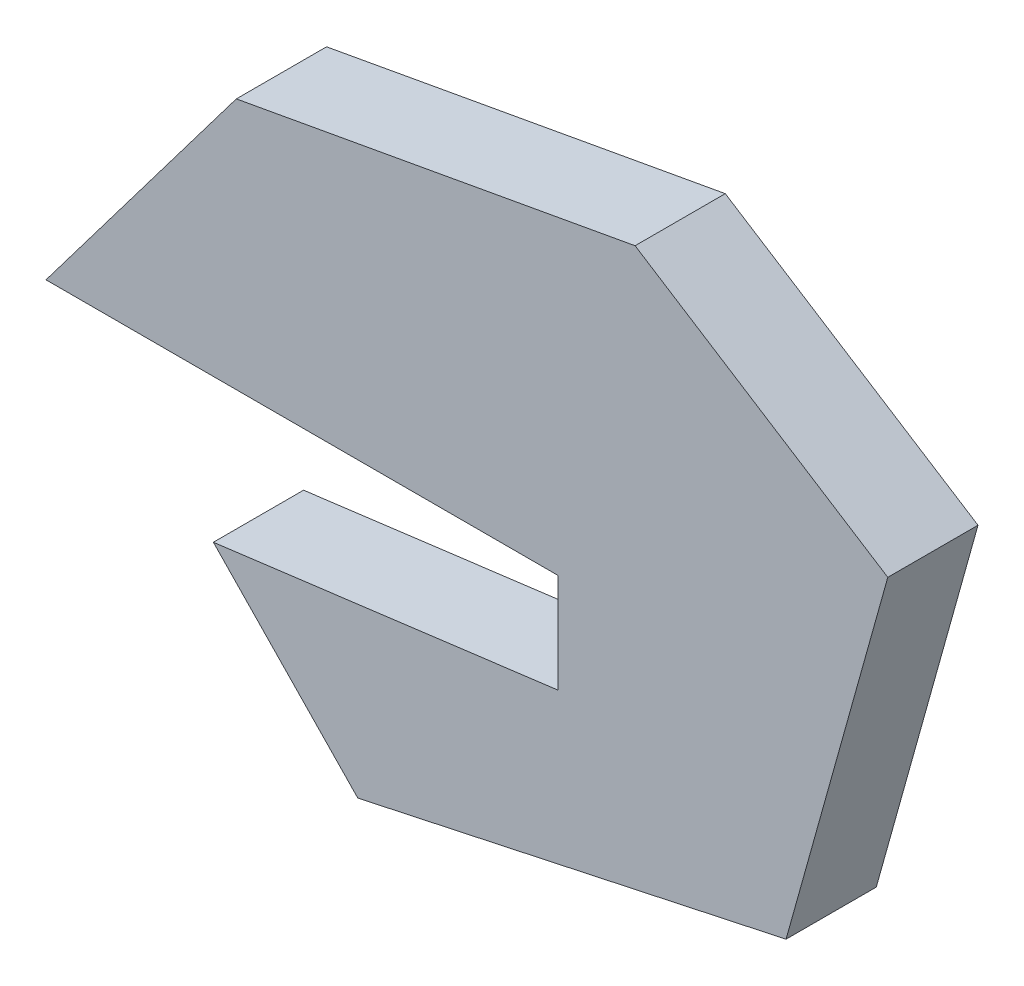
ISO-10303-21;
HEADER;
FILE_DESCRIPTION(('STEP AP214'),'2;1');
FILE_NAME('part.step','',(''),(''),'','','');
FILE_SCHEMA(('AUTOMOTIVE_DESIGN { 1 0 10303 214 1 1 1 1 }'));
ENDSEC;
DATA;
#1=APPLICATION_CONTEXT('core data for automotive mechanical design processes');
#2=APPLICATION_PROTOCOL_DEFINITION('international standard','automotive_design',2000,#1);
#3=PRODUCT_CONTEXT('',#1,'mechanical');
#4=PRODUCT('Part','Part','',(#3));
#5=PRODUCT_RELATED_PRODUCT_CATEGORY('part','',(#4));
#6=PRODUCT_DEFINITION_FORMATION('','',#4);
#7=PRODUCT_DEFINITION_CONTEXT('part definition',#1,'design');
#8=PRODUCT_DEFINITION('design','',#6,#7);
#9=PRODUCT_DEFINITION_SHAPE('','',#8);
#10=(LENGTH_UNIT() NAMED_UNIT(*) SI_UNIT(.MILLI.,.METRE.));
#11=(NAMED_UNIT(*) PLANE_ANGLE_UNIT() SI_UNIT($,.RADIAN.));
#12=(NAMED_UNIT(*) SI_UNIT($,.STERADIAN.) SOLID_ANGLE_UNIT());
#13=UNCERTAINTY_MEASURE_WITH_UNIT(LENGTH_MEASURE(1.E-05),#10,'distance_accuracy_value','');
#14=(GEOMETRIC_REPRESENTATION_CONTEXT(3) GLOBAL_UNCERTAINTY_ASSIGNED_CONTEXT((#13)) GLOBAL_UNIT_ASSIGNED_CONTEXT((#10,
#11,#12)) REPRESENTATION_CONTEXT('',''));
#15=CARTESIAN_POINT('',(0.,0.,0.));
#16=DIRECTION('',(0.,0.,1.));
#17=DIRECTION('',(1.,0.,0.));
#18=AXIS2_PLACEMENT_3D('',#15,#16,#17);
#19=CARTESIAN_POINT('',(0.,-22.0192849403379,20.));
#20=DIRECTION('',(1.,0.,0.));
#21=DIRECTION('',(0.,0.,-1.));
#22=AXIS2_PLACEMENT_3D('',#19,#20,#21);
#23=PLANE('',#22);
#24=DIRECTION('',(0.,-1.,0.));
#25=VECTOR('',#24,1.);
#26=CARTESIAN_POINT('',(0.,-22.0192849403379,0.));
#27=LINE('',#26,#25);
#28=CARTESIAN_POINT('',(0.,0.,0.));
#29=VERTEX_POINT('',#28);
#30=CARTESIAN_POINT('',(0.,-22.0192849403379,0.));
#31=VERTEX_POINT('',#30);
#32=EDGE_CURVE('E146',#29,#31,#27,.T.);
#33=ORIENTED_EDGE('',*,*,#32,.T.);
#34=DIRECTION('',(0.,0.,-1.));
#35=VECTOR('',#34,1.);
#36=CARTESIAN_POINT('',(0.,-22.0192849403379,20.));
#37=LINE('',#36,#35);
#38=CARTESIAN_POINT('',(0.,-22.0192849403379,20.));
#39=VERTEX_POINT('',#38);
#40=EDGE_CURVE('E11',#39,#31,#37,.T.);
#41=ORIENTED_EDGE('',*,*,#40,.F.);
#42=DIRECTION('',(0.,-1.,0.));
#43=VECTOR('',#42,1.);
#44=CARTESIAN_POINT('',(0.,-22.0192849403379,20.));
#45=LINE('',#44,#43);
#46=CARTESIAN_POINT('',(0.,0.,20.));
#47=VERTEX_POINT('',#46);
#48=EDGE_CURVE('E171',#47,#39,#45,.T.);
#49=ORIENTED_EDGE('',*,*,#48,.F.);
#50=DIRECTION('',(0.,0.,-1.));
#51=VECTOR('',#50,1.);
#52=CARTESIAN_POINT('',(0.,0.,20.));
#53=LINE('',#52,#51);
#54=EDGE_CURVE('E142',#47,#29,#53,.T.);
#55=ORIENTED_EDGE('',*,*,#54,.T.);
#56=EDGE_LOOP('',(#33,#41,#49,#55));
#57=FACE_BOUND('',#56,.T.);
#58=ADVANCED_FACE('F39',(#57),#23,.F.);
#59=CARTESIAN_POINT('',(-76.4028207371506,-31.8345086404794,20.));
#60=DIRECTION('',(0.127419625730116,-0.991848899267826,0.));
#61=DIRECTION('',(0.991848899267826,0.127419625730116,0.));
#62=AXIS2_PLACEMENT_3D('',#59,#60,#61);
#63=PLANE('',#62);
#64=DIRECTION('',(-0.991848899267826,-0.127419625730116,0.));
#65=VECTOR('',#64,1.);
#66=CARTESIAN_POINT('',(-76.4028207371506,-31.8345086404794,0.));
#67=LINE('',#66,#65);
#68=CARTESIAN_POINT('',(-76.4028207371506,-31.8345086404794,0.));
#69=VERTEX_POINT('',#68);
#70=EDGE_CURVE('E150',#31,#69,#67,.T.);
#71=ORIENTED_EDGE('',*,*,#70,.T.);
#72=DIRECTION('',(0.,0.,-1.));
#73=VECTOR('',#72,1.);
#74=CARTESIAN_POINT('',(-76.4028207371506,-31.8345086404794,20.));
#75=LINE('',#74,#73);
#76=CARTESIAN_POINT('',(-76.4028207371506,-31.8345086404794,20.));
#77=VERTEX_POINT('',#76);
#78=EDGE_CURVE('E48',#77,#69,#75,.T.);
#79=ORIENTED_EDGE('',*,*,#78,.F.);
#80=DIRECTION('',(-0.991848899267826,-0.127419625730116,0.));
#81=VECTOR('',#80,1.);
#82=CARTESIAN_POINT('',(-76.4028207371506,-31.8345086404794,20.));
#83=LINE('',#82,#81);
#84=EDGE_CURVE('E102',#39,#77,#83,.T.);
#85=ORIENTED_EDGE('',*,*,#84,.F.);
#86=ORIENTED_EDGE('',*,*,#40,.T.);
#87=EDGE_LOOP('',(#71,#79,#85,#86));
#88=FACE_BOUND('',#87,.T.);
#89=ADVANCED_FACE('F227',(#88),#63,.F.);
#90=CARTESIAN_POINT('',(-44.3864006187256,-64.942397626578,20.));
#91=DIRECTION('',(0.718856780035361,0.695158204869361,0.));
#92=DIRECTION('',(-0.695158204869361,0.718856780035361,0.));
#93=AXIS2_PLACEMENT_3D('',#90,#91,#92);
#94=PLANE('',#93);
#95=DIRECTION('',(0.695158204869361,-0.718856780035361,0.));
#96=VECTOR('',#95,1.);
#97=CARTESIAN_POINT('',(-44.3864006187256,-64.942397626578,0.));
#98=LINE('',#97,#96);
#99=CARTESIAN_POINT('',(-44.3864006187256,-64.942397626578,0.));
#100=VERTEX_POINT('',#99);
#101=EDGE_CURVE('E153',#69,#100,#98,.T.);
#102=ORIENTED_EDGE('',*,*,#101,.T.);
#103=DIRECTION('',(0.,0.,-1.));
#104=VECTOR('',#103,1.);
#105=CARTESIAN_POINT('',(-44.3864006187256,-64.942397626578,20.));
#106=LINE('',#105,#104);
#107=CARTESIAN_POINT('',(-44.3864006187256,-64.942397626578,20.));
#108=VERTEX_POINT('',#107);
#109=EDGE_CURVE('E186',#108,#100,#106,.T.);
#110=ORIENTED_EDGE('',*,*,#109,.F.);
#111=DIRECTION('',(0.695158204869361,-0.718856780035361,0.));
#112=VECTOR('',#111,1.);
#113=CARTESIAN_POINT('',(-44.3864006187256,-64.942397626578,20.));
#114=LINE('',#113,#112);
#115=EDGE_CURVE('E196',#77,#108,#114,.T.);
#116=ORIENTED_EDGE('',*,*,#115,.F.);
#117=ORIENTED_EDGE('',*,*,#78,.T.);
#118=EDGE_LOOP('',(#102,#110,#116,#117));
#119=FACE_BOUND('',#118,.T.);
#120=ADVANCED_FACE('F194',(#119),#94,.F.);
#121=CARTESIAN_POINT('',(50.5713908688759,-44.5683120966712,20.));
#122=DIRECTION('',(-0.209784916823414,0.977747558766266,0.));
#123=DIRECTION('',(-0.977747558766266,-0.209784916823414,0.));
#124=AXIS2_PLACEMENT_3D('',#121,#122,#123);
#125=PLANE('',#124);
#126=DIRECTION('',(0.977747558766266,0.209784916823413,0.));
#127=VECTOR('',#126,1.);
#128=CARTESIAN_POINT('',(50.5713908688759,-44.5683120966712,0.));
#129=LINE('',#128,#127);
#130=CARTESIAN_POINT('',(50.5713908688759,-44.5683120966712,0.));
#131=VERTEX_POINT('',#130);
#132=EDGE_CURVE('E156',#100,#131,#129,.T.);
#133=ORIENTED_EDGE('',*,*,#132,.T.);
#134=DIRECTION('',(0.,0.,-1.));
#135=VECTOR('',#134,1.);
#136=CARTESIAN_POINT('',(50.5713908688759,-44.5683120966712,20.));
#137=LINE('',#136,#135);
#138=CARTESIAN_POINT('',(50.5713908688759,-44.5683120966712,20.));
#139=VERTEX_POINT('',#138);
#140=EDGE_CURVE('E182',#139,#131,#137,.T.);
#141=ORIENTED_EDGE('',*,*,#140,.F.);
#142=DIRECTION('',(0.977747558766266,0.209784916823413,0.));
#143=VECTOR('',#142,1.);
#144=CARTESIAN_POINT('',(50.5713908688759,-44.5683120966712,20.));
#145=LINE('',#144,#143);
#146=EDGE_CURVE('E213',#108,#139,#145,.T.);
#147=ORIENTED_EDGE('',*,*,#146,.F.);
#148=ORIENTED_EDGE('',*,*,#109,.T.);
#149=EDGE_LOOP('',(#133,#141,#147,#148));
#150=FACE_BOUND('',#149,.T.);
#151=ADVANCED_FACE('F205',(#150),#125,.F.);
#152=CARTESIAN_POINT('',(73.1284141341299,36.2003841111737,20.));
#153=DIRECTION('',(-0.963144038443544,0.268986172898648,0.));
#154=DIRECTION('',(-0.268986172898648,-0.963144038443544,0.));
#155=AXIS2_PLACEMENT_3D('',#152,#153,#154);
#156=PLANE('',#155);
#157=DIRECTION('',(0.268986172898648,0.963144038443544,0.));
#158=VECTOR('',#157,1.);
#159=CARTESIAN_POINT('',(73.1284141341299,36.2003841111737,0.));
#160=LINE('',#159,#158);
#161=CARTESIAN_POINT('',(73.1284141341299,36.2003841111737,0.));
#162=VERTEX_POINT('',#161);
#163=EDGE_CURVE('E159',#131,#162,#160,.T.);
#164=ORIENTED_EDGE('',*,*,#163,.T.);
#165=DIRECTION('',(0.,0.,-1.));
#166=VECTOR('',#165,1.);
#167=CARTESIAN_POINT('',(73.1284141341299,36.2003841111737,20.));
#168=LINE('',#167,#166);
#169=CARTESIAN_POINT('',(73.1284141341299,36.2003841111737,20.));
#170=VERTEX_POINT('',#169);
#171=EDGE_CURVE('E178',#170,#162,#168,.T.);
#172=ORIENTED_EDGE('',*,*,#171,.F.);
#173=DIRECTION('',(0.268986172898648,0.963144038443544,0.));
#174=VECTOR('',#173,1.);
#175=CARTESIAN_POINT('',(73.1284141341299,36.2003841111737,20.));
#176=LINE('',#175,#174);
#177=EDGE_CURVE('E211',#139,#170,#176,.T.);
#178=ORIENTED_EDGE('',*,*,#177,.F.);
#179=ORIENTED_EDGE('',*,*,#140,.T.);
#180=EDGE_LOOP('',(#164,#172,#178,#179));
#181=FACE_BOUND('',#180,.T.);
#182=ADVANCED_FACE('F209',(#181),#156,.F.);
#183=CARTESIAN_POINT('',(17.0996789268861,71.8550337885107,20.));
#184=DIRECTION('',(-0.536875492193159,-0.843661487732108,0.));
#185=DIRECTION('',(0.843661487732108,-0.536875492193159,0.));
#186=AXIS2_PLACEMENT_3D('',#183,#184,#185);
#187=PLANE('',#186);
#188=DIRECTION('',(-0.843661487732107,0.536875492193159,0.));
#189=VECTOR('',#188,1.);
#190=CARTESIAN_POINT('',(17.0996789268861,71.8550337885107,0.));
#191=LINE('',#190,#189);
#192=CARTESIAN_POINT('',(17.0996789268861,71.8550337885107,0.));
#193=VERTEX_POINT('',#192);
#194=EDGE_CURVE('E162',#162,#193,#191,.T.);
#195=ORIENTED_EDGE('',*,*,#194,.T.);
#196=DIRECTION('',(0.,0.,-1.));
#197=VECTOR('',#196,1.);
#198=CARTESIAN_POINT('',(17.0996789268861,71.8550337885107,20.));
#199=LINE('',#198,#197);
#200=CARTESIAN_POINT('',(17.0996789268861,71.8550337885107,20.));
#201=VERTEX_POINT('',#200);
#202=EDGE_CURVE('E135',#201,#193,#199,.T.);
#203=ORIENTED_EDGE('',*,*,#202,.F.);
#204=DIRECTION('',(-0.843661487732107,0.536875492193159,0.));
#205=VECTOR('',#204,1.);
#206=CARTESIAN_POINT('',(17.0996789268861,71.8550337885107,20.));
#207=LINE('',#206,#205);
#208=EDGE_CURVE('E124',#170,#201,#207,.T.);
#209=ORIENTED_EDGE('',*,*,#208,.F.);
#210=ORIENTED_EDGE('',*,*,#171,.T.);
#211=EDGE_LOOP('',(#195,#203,#209,#210));
#212=FACE_BOUND('',#211,.T.);
#213=ADVANCED_FACE('F239',(#212),#187,.F.);
#214=CARTESIAN_POINT('',(-71.3092993546739,55.8468237292982,20.));
#215=DIRECTION('',(0.178172700465802,-0.983999232117954,0.));
#216=DIRECTION('',(0.983999232117954,0.178172700465802,0.));
#217=AXIS2_PLACEMENT_3D('',#214,#215,#216);
#218=PLANE('',#217);
#219=DIRECTION('',(-0.983999232117954,-0.178172700465802,0.));
#220=VECTOR('',#219,1.);
#221=CARTESIAN_POINT('',(-71.3092993546739,55.8468237292982,0.));
#222=LINE('',#221,#220);
#223=CARTESIAN_POINT('',(-71.3092993546739,55.8468237292982,0.));
#224=VERTEX_POINT('',#223);
#225=EDGE_CURVE('E133',#193,#224,#222,.T.);
#226=ORIENTED_EDGE('',*,*,#225,.T.);
#227=DIRECTION('',(0.,0.,-1.));
#228=VECTOR('',#227,1.);
#229=CARTESIAN_POINT('',(-71.3092993546739,55.8468237292982,20.));
#230=LINE('',#229,#228);
#231=CARTESIAN_POINT('',(-71.3092993546739,55.8468237292982,20.));
#232=VERTEX_POINT('',#231);
#233=EDGE_CURVE('E130',#232,#224,#230,.T.);
#234=ORIENTED_EDGE('',*,*,#233,.F.);
#235=DIRECTION('',(-0.983999232117954,-0.178172700465802,0.));
#236=VECTOR('',#235,1.);
#237=CARTESIAN_POINT('',(-71.3092993546739,55.8468237292982,20.));
#238=LINE('',#237,#236);
#239=EDGE_CURVE('E118',#201,#232,#238,.T.);
#240=ORIENTED_EDGE('',*,*,#239,.F.);
#241=ORIENTED_EDGE('',*,*,#202,.T.);
#242=EDGE_LOOP('',(#226,#234,#240,#241));
#243=FACE_BOUND('',#242,.T.);
#244=ADVANCED_FACE('F131',(#243),#218,.F.);
#245=CARTESIAN_POINT('',(-113.512762238052,0.,20.));
#246=DIRECTION('',(0.797811767561402,-0.602906612619691,0.));
#247=DIRECTION('',(0.602906612619691,0.797811767561402,0.));
#248=AXIS2_PLACEMENT_3D('',#245,#246,#247);
#249=PLANE('',#248);
#250=DIRECTION('',(-0.602906612619691,-0.797811767561402,0.));
#251=VECTOR('',#250,1.);
#252=CARTESIAN_POINT('',(-113.512762238052,0.,0.));
#253=LINE('',#252,#251);
#254=CARTESIAN_POINT('',(-113.512762238052,0.,0.));
#255=VERTEX_POINT('',#254);
#256=EDGE_CURVE('E88',#224,#255,#253,.T.);
#257=ORIENTED_EDGE('',*,*,#256,.T.);
#258=DIRECTION('',(0.,0.,-1.));
#259=VECTOR('',#258,1.);
#260=CARTESIAN_POINT('',(-113.512762238052,0.,20.));
#261=LINE('',#260,#259);
#262=CARTESIAN_POINT('',(-113.512762238052,0.,20.));
#263=VERTEX_POINT('',#262);
#264=EDGE_CURVE('E136',#263,#255,#261,.T.);
#265=ORIENTED_EDGE('',*,*,#264,.F.);
#266=DIRECTION('',(-0.602906612619691,-0.797811767561402,0.));
#267=VECTOR('',#266,1.);
#268=CARTESIAN_POINT('',(-113.512762238052,0.,20.));
#269=LINE('',#268,#267);
#270=EDGE_CURVE('E122',#232,#263,#269,.T.);
#271=ORIENTED_EDGE('',*,*,#270,.F.);
#272=ORIENTED_EDGE('',*,*,#233,.T.);
#273=EDGE_LOOP('',(#257,#265,#271,#272));
#274=FACE_BOUND('',#273,.T.);
#275=ADVANCED_FACE('F138',(#274),#249,.F.);
#276=CARTESIAN_POINT('',(0.,0.,20.));
#277=DIRECTION('',(0.,1.,0.));
#278=DIRECTION('',(0.,0.,1.));
#279=AXIS2_PLACEMENT_3D('',#276,#277,#278);
#280=PLANE('',#279);
#281=DIRECTION('',(1.,0.,0.));
#282=VECTOR('',#281,1.);
#283=CARTESIAN_POINT('',(0.,0.,0.));
#284=LINE('',#283,#282);
#285=EDGE_CURVE('E94',#255,#29,#284,.T.);
#286=ORIENTED_EDGE('',*,*,#285,.T.);
#287=ORIENTED_EDGE('',*,*,#54,.F.);
#288=DIRECTION('',(1.,0.,0.));
#289=VECTOR('',#288,1.);
#290=CARTESIAN_POINT('',(0.,0.,20.));
#291=LINE('',#290,#289);
#292=EDGE_CURVE('E56',#263,#47,#291,.T.);
#293=ORIENTED_EDGE('',*,*,#292,.F.);
#294=ORIENTED_EDGE('',*,*,#264,.T.);
#295=EDGE_LOOP('',(#286,#287,#293,#294));
#296=FACE_BOUND('',#295,.T.);
#297=ADVANCED_FACE('F247',(#296),#280,.F.);
#298=CARTESIAN_POINT('',(0.,0.,20.));
#299=DIRECTION('',(0.,0.,1.));
#300=DIRECTION('',(1.,0.,0.));
#301=AXIS2_PLACEMENT_3D('',#298,#299,#300);
#302=PLANE('',#301);
#303=ORIENTED_EDGE('',*,*,#48,.T.);
#304=ORIENTED_EDGE('',*,*,#84,.T.);
#305=ORIENTED_EDGE('',*,*,#115,.T.);
#306=ORIENTED_EDGE('',*,*,#146,.T.);
#307=ORIENTED_EDGE('',*,*,#177,.T.);
#308=ORIENTED_EDGE('',*,*,#208,.T.);
#309=ORIENTED_EDGE('',*,*,#239,.T.);
#310=ORIENTED_EDGE('',*,*,#270,.T.);
#311=ORIENTED_EDGE('',*,*,#292,.T.);
#312=EDGE_LOOP('',(#303,#304,#305,#306,#307,#308,#309,#310,#311));
#313=FACE_BOUND('',#312,.T.);
#314=ADVANCED_FACE('F120',(#313),#302,.T.);
#315=CARTESIAN_POINT('',(0.,0.,0.));
#316=DIRECTION('',(0.,0.,1.));
#317=DIRECTION('',(1.,0.,0.));
#318=AXIS2_PLACEMENT_3D('',#315,#316,#317);
#319=PLANE('',#318);
#320=ORIENTED_EDGE('',*,*,#32,.F.);
#321=ORIENTED_EDGE('',*,*,#285,.F.);
#322=ORIENTED_EDGE('',*,*,#256,.F.);
#323=ORIENTED_EDGE('',*,*,#225,.F.);
#324=ORIENTED_EDGE('',*,*,#194,.F.);
#325=ORIENTED_EDGE('',*,*,#163,.F.);
#326=ORIENTED_EDGE('',*,*,#132,.F.);
#327=ORIENTED_EDGE('',*,*,#101,.F.);
#328=ORIENTED_EDGE('',*,*,#70,.F.);
#329=EDGE_LOOP('',(#320,#321,#322,#323,#324,#325,#326,#327,#328));
#330=FACE_BOUND('',#329,.T.);
#331=ADVANCED_FACE('F200',(#330),#319,.F.);
#332=CLOSED_SHELL('',(#58,#89,#120,#151,#182,#213,#244,#275,#297,#314,#331));
#333=MANIFOLD_SOLID_BREP('B2',#332);
#334=ADVANCED_BREP_SHAPE_REPRESENTATION('',(#18,#333),#14);
#335=SHAPE_DEFINITION_REPRESENTATION(#9,#334);
ENDSEC;
END-ISO-10303-21;
